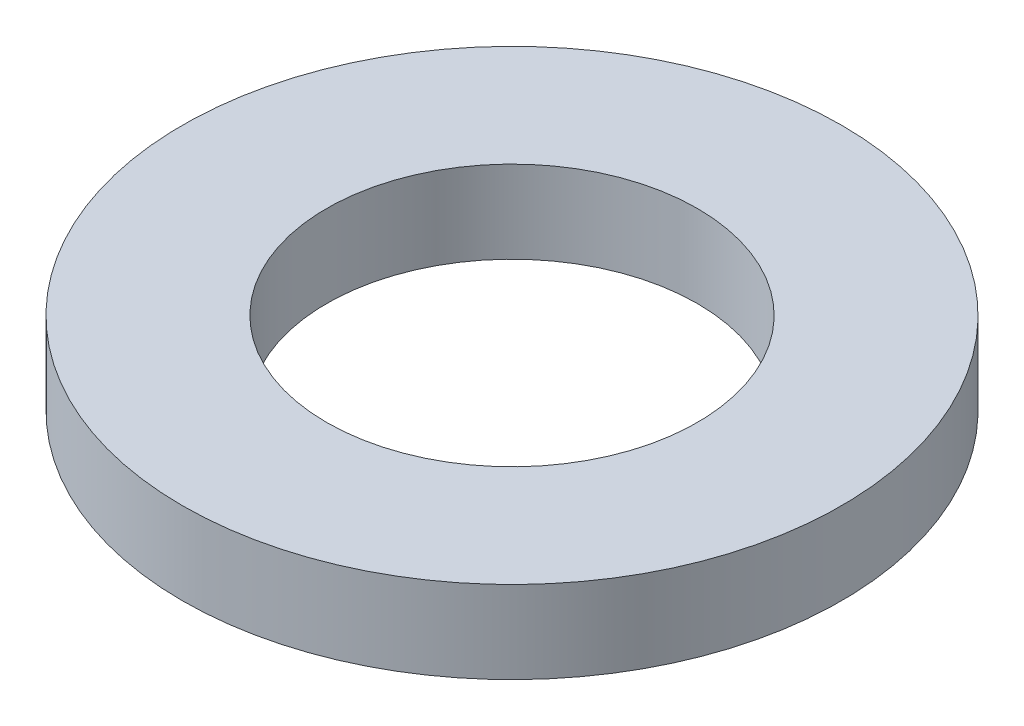
ISO-10303-21;
HEADER;
FILE_DESCRIPTION(('STEP AP214'),'2;1');
FILE_NAME('part.step','',(''),(''),'','','');
FILE_SCHEMA(('AUTOMOTIVE_DESIGN { 1 0 10303 214 1 1 1 1 }'));
ENDSEC;
DATA;
#1=APPLICATION_CONTEXT('core data for automotive mechanical design processes');
#2=APPLICATION_PROTOCOL_DEFINITION('international standard','automotive_design',2000,#1);
#3=PRODUCT_CONTEXT('',#1,'mechanical');
#4=PRODUCT('Part','Part','',(#3));
#5=PRODUCT_RELATED_PRODUCT_CATEGORY('part','',(#4));
#6=PRODUCT_DEFINITION_FORMATION('','',#4);
#7=PRODUCT_DEFINITION_CONTEXT('part definition',#1,'design');
#8=PRODUCT_DEFINITION('design','',#6,#7);
#9=PRODUCT_DEFINITION_SHAPE('','',#8);
#10=(LENGTH_UNIT() NAMED_UNIT(*) SI_UNIT(.MILLI.,.METRE.));
#11=(NAMED_UNIT(*) PLANE_ANGLE_UNIT() SI_UNIT($,.RADIAN.));
#12=(NAMED_UNIT(*) SI_UNIT($,.STERADIAN.) SOLID_ANGLE_UNIT());
#13=UNCERTAINTY_MEASURE_WITH_UNIT(LENGTH_MEASURE(1.E-05),#10,'distance_accuracy_value','');
#14=(GEOMETRIC_REPRESENTATION_CONTEXT(3) GLOBAL_UNCERTAINTY_ASSIGNED_CONTEXT((#13)) GLOBAL_UNIT_ASSIGNED_CONTEXT((#10,
#11,#12)) REPRESENTATION_CONTEXT('',''));
#15=CARTESIAN_POINT('',(0.,0.,0.));
#16=DIRECTION('',(0.,0.,1.));
#17=DIRECTION('',(1.,0.,0.));
#18=AXIS2_PLACEMENT_3D('',#15,#16,#17);
#19=CARTESIAN_POINT('',(0.,2.54,0.));
#20=DIRECTION('',(0.,-1.,0.));
#21=DIRECTION('',(0.,0.,-1.));
#22=AXIS2_PLACEMENT_3D('',#19,#20,#21);
#23=CYLINDRICAL_SURFACE('',#22,10.16);
#24=CARTESIAN_POINT('',(0.,2.54,0.));
#25=DIRECTION('',(0.,1.,0.));
#26=DIRECTION('',(0.,0.,1.));
#27=AXIS2_PLACEMENT_3D('',#24,#25,#26);
#28=CIRCLE('',#27,10.16);
#29=CARTESIAN_POINT('',(0.,2.54,10.16));
#30=VERTEX_POINT('',#29);
#31=EDGE_CURVE('E10',#30,#30,#28,.T.);
#32=ORIENTED_EDGE('',*,*,#31,.F.);
#33=EDGE_LOOP('',(#32));
#34=FACE_BOUND('',#33,.T.);
#35=CARTESIAN_POINT('',(0.,0.,0.));
#36=DIRECTION('',(0.,1.,0.));
#37=DIRECTION('',(0.,0.,1.));
#38=AXIS2_PLACEMENT_3D('',#35,#36,#37);
#39=CIRCLE('',#38,10.16);
#40=CARTESIAN_POINT('',(0.,0.,10.16));
#41=VERTEX_POINT('',#40);
#42=EDGE_CURVE('E33',#41,#41,#39,.T.);
#43=ORIENTED_EDGE('',*,*,#42,.T.);
#44=EDGE_LOOP('',(#43));
#45=FACE_BOUND('',#44,.T.);
#46=ADVANCED_FACE('F30',(#34,#45),#23,.T.);
#47=CARTESIAN_POINT('',(0.,2.54,0.));
#48=DIRECTION('',(0.,1.,0.));
#49=DIRECTION('',(0.,0.,1.));
#50=AXIS2_PLACEMENT_3D('',#47,#48,#49);
#51=PLANE('',#50);
#52=CARTESIAN_POINT('',(0.,2.54,0.));
#53=DIRECTION('',(0.,1.,0.));
#54=DIRECTION('',(0.,0.,1.));
#55=AXIS2_PLACEMENT_3D('',#52,#53,#54);
#56=CIRCLE('',#55,5.715);
#57=CARTESIAN_POINT('',(0.,2.54,5.715));
#58=VERTEX_POINT('',#57);
#59=EDGE_CURVE('E42',#58,#58,#56,.T.);
#60=ORIENTED_EDGE('',*,*,#59,.F.);
#61=EDGE_LOOP('',(#60));
#62=FACE_BOUND('',#61,.T.);
#63=ORIENTED_EDGE('',*,*,#31,.T.);
#64=EDGE_LOOP('',(#63));
#65=FACE_BOUND('',#64,.T.);
#66=ADVANCED_FACE('F57',(#62,#65),#51,.T.);
#67=CARTESIAN_POINT('',(0.,0.,0.));
#68=DIRECTION('',(0.,1.,0.));
#69=DIRECTION('',(0.,0.,1.));
#70=AXIS2_PLACEMENT_3D('',#67,#68,#69);
#71=PLANE('',#70);
#72=CARTESIAN_POINT('',(0.,0.,0.));
#73=DIRECTION('',(0.,1.,0.));
#74=DIRECTION('',(0.,0.,1.));
#75=AXIS2_PLACEMENT_3D('',#72,#73,#74);
#76=CIRCLE('',#75,5.715);
#77=CARTESIAN_POINT('',(0.,0.,5.715));
#78=VERTEX_POINT('',#77);
#79=EDGE_CURVE('E40',#78,#78,#76,.T.);
#80=ORIENTED_EDGE('',*,*,#79,.T.);
#81=EDGE_LOOP('',(#80));
#82=FACE_BOUND('',#81,.T.);
#83=ORIENTED_EDGE('',*,*,#42,.F.);
#84=EDGE_LOOP('',(#83));
#85=FACE_BOUND('',#84,.T.);
#86=ADVANCED_FACE('F48',(#82,#85),#71,.F.);
#87=CARTESIAN_POINT('',(0.,0.,0.));
#88=DIRECTION('',(0.,1.,0.));
#89=DIRECTION('',(0.,0.,1.));
#90=AXIS2_PLACEMENT_3D('',#87,#88,#89);
#91=CYLINDRICAL_SURFACE('',#90,5.715);
#92=ORIENTED_EDGE('',*,*,#79,.F.);
#93=EDGE_LOOP('',(#92));
#94=FACE_BOUND('',#93,.T.);
#95=ORIENTED_EDGE('',*,*,#59,.T.);
#96=EDGE_LOOP('',(#95));
#97=FACE_BOUND('',#96,.T.);
#98=ADVANCED_FACE('F51',(#94,#97),#91,.F.);
#99=CLOSED_SHELL('',(#46,#66,#86,#98));
#100=MANIFOLD_SOLID_BREP('B2',#99);
#101=ADVANCED_BREP_SHAPE_REPRESENTATION('',(#18,#100),#14);
#102=SHAPE_DEFINITION_REPRESENTATION(#9,#101);
ENDSEC;
END-ISO-10303-21;
